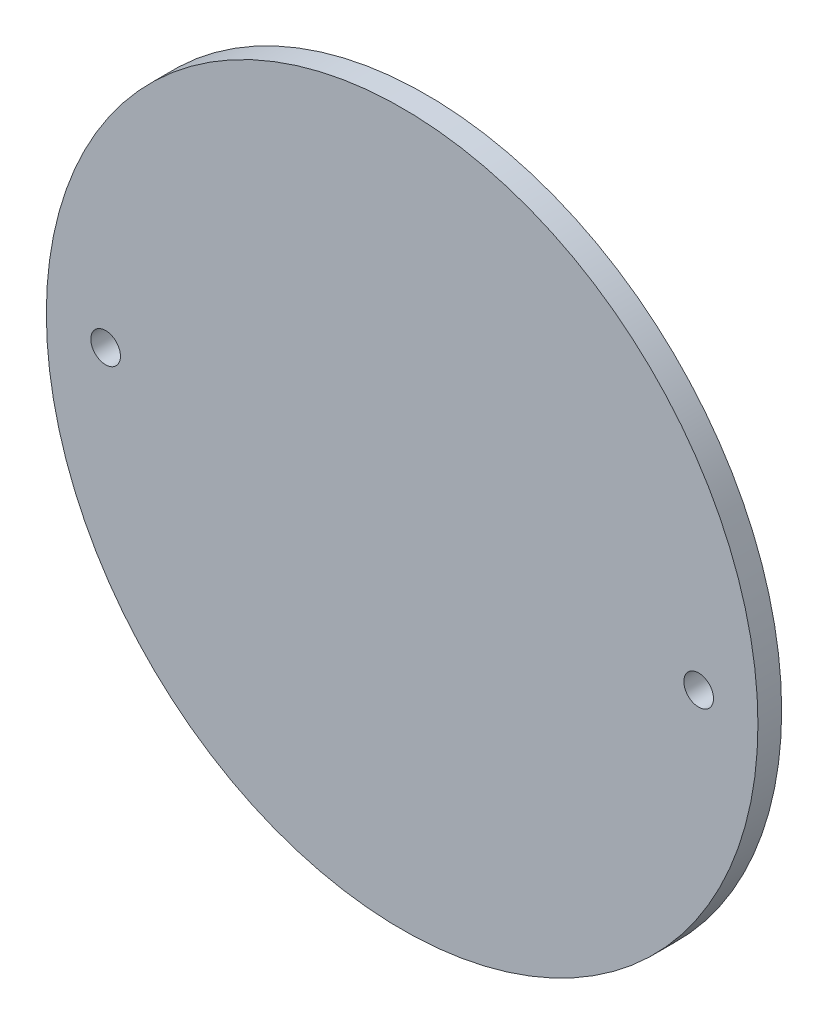
ISO-10303-21;
HEADER;
FILE_DESCRIPTION(('STEP AP214'),'2;1');
FILE_NAME('part.step','',(''),(''),'','','');
FILE_SCHEMA(('AUTOMOTIVE_DESIGN { 1 0 10303 214 1 1 1 1 }'));
ENDSEC;
DATA;
#1=APPLICATION_CONTEXT('core data for automotive mechanical design processes');
#2=APPLICATION_PROTOCOL_DEFINITION('international standard','automotive_design',2000,#1);
#3=PRODUCT_CONTEXT('',#1,'mechanical');
#4=PRODUCT('Part','Part','',(#3));
#5=PRODUCT_RELATED_PRODUCT_CATEGORY('part','',(#4));
#6=PRODUCT_DEFINITION_FORMATION('','',#4);
#7=PRODUCT_DEFINITION_CONTEXT('part definition',#1,'design');
#8=PRODUCT_DEFINITION('design','',#6,#7);
#9=PRODUCT_DEFINITION_SHAPE('','',#8);
#10=(LENGTH_UNIT() NAMED_UNIT(*) SI_UNIT(.MILLI.,.METRE.));
#11=(NAMED_UNIT(*) PLANE_ANGLE_UNIT() SI_UNIT($,.RADIAN.));
#12=(NAMED_UNIT(*) SI_UNIT($,.STERADIAN.) SOLID_ANGLE_UNIT());
#13=UNCERTAINTY_MEASURE_WITH_UNIT(LENGTH_MEASURE(1.E-05),#10,'distance_accuracy_value','');
#14=(GEOMETRIC_REPRESENTATION_CONTEXT(3) GLOBAL_UNCERTAINTY_ASSIGNED_CONTEXT((#13)) GLOBAL_UNIT_ASSIGNED_CONTEXT((#10,
#11,#12)) REPRESENTATION_CONTEXT('',''));
#15=CARTESIAN_POINT('',(0.,0.,0.));
#16=DIRECTION('',(0.,0.,1.));
#17=DIRECTION('',(1.,0.,0.));
#18=AXIS2_PLACEMENT_3D('',#15,#16,#17);
#19=CARTESIAN_POINT('',(0.,0.,2.));
#20=DIRECTION('',(0.,0.,1.));
#21=DIRECTION('',(1.,0.,0.));
#22=AXIS2_PLACEMENT_3D('',#19,#20,#21);
#23=PLANE('',#22);
#24=CARTESIAN_POINT('',(25.,0.,2.));
#25=DIRECTION('',(0.,0.,1.));
#26=DIRECTION('',(1.,0.,0.));
#27=AXIS2_PLACEMENT_3D('',#24,#25,#26);
#28=CIRCLE('',#27,1.25);
#29=CARTESIAN_POINT('',(26.25,0.,2.));
#30=VERTEX_POINT('',#29);
#31=EDGE_CURVE('E42',#30,#30,#28,.T.);
#32=ORIENTED_EDGE('',*,*,#31,.F.);
#33=EDGE_LOOP('',(#32));
#34=FACE_BOUND('',#33,.T.);
#35=CARTESIAN_POINT('',(0.,0.,2.));
#36=DIRECTION('',(0.,0.,1.));
#37=DIRECTION('',(1.,0.,0.));
#38=AXIS2_PLACEMENT_3D('',#35,#36,#37);
#39=CIRCLE('',#38,30.);
#40=CARTESIAN_POINT('',(30.,0.,2.));
#41=VERTEX_POINT('',#40);
#42=EDGE_CURVE('E10',#41,#41,#39,.T.);
#43=ORIENTED_EDGE('',*,*,#42,.T.);
#44=EDGE_LOOP('',(#43));
#45=FACE_BOUND('',#44,.T.);
#46=CARTESIAN_POINT('',(-25.,0.,2.));
#47=DIRECTION('',(0.,0.,1.));
#48=DIRECTION('',(1.,0.,0.));
#49=AXIS2_PLACEMENT_3D('',#46,#47,#48);
#50=CIRCLE('',#49,1.25);
#51=CARTESIAN_POINT('',(-23.75,0.,2.));
#52=VERTEX_POINT('',#51);
#53=EDGE_CURVE('E47',#52,#52,#50,.T.);
#54=ORIENTED_EDGE('',*,*,#53,.F.);
#55=EDGE_LOOP('',(#54));
#56=FACE_BOUND('',#55,.T.);
#57=ADVANCED_FACE('F31',(#34,#45,#56),#23,.T.);
#58=CARTESIAN_POINT('',(0.,0.,0.));
#59=DIRECTION('',(0.,0.,1.));
#60=DIRECTION('',(1.,0.,0.));
#61=AXIS2_PLACEMENT_3D('',#58,#59,#60);
#62=PLANE('',#61);
#63=CARTESIAN_POINT('',(25.,0.,0.));
#64=DIRECTION('',(0.,0.,1.));
#65=DIRECTION('',(1.,0.,0.));
#66=AXIS2_PLACEMENT_3D('',#63,#64,#65);
#67=CIRCLE('',#66,1.25);
#68=CARTESIAN_POINT('',(26.25,0.,0.));
#69=VERTEX_POINT('',#68);
#70=EDGE_CURVE('E44',#69,#69,#67,.T.);
#71=ORIENTED_EDGE('',*,*,#70,.T.);
#72=EDGE_LOOP('',(#71));
#73=FACE_BOUND('',#72,.T.);
#74=CARTESIAN_POINT('',(0.,0.,0.));
#75=DIRECTION('',(0.,0.,1.));
#76=DIRECTION('',(1.,0.,0.));
#77=AXIS2_PLACEMENT_3D('',#74,#75,#76);
#78=CIRCLE('',#77,30.);
#79=CARTESIAN_POINT('',(30.,0.,0.));
#80=VERTEX_POINT('',#79);
#81=EDGE_CURVE('E35',#80,#80,#78,.T.);
#82=ORIENTED_EDGE('',*,*,#81,.F.);
#83=EDGE_LOOP('',(#82));
#84=FACE_BOUND('',#83,.T.);
#85=CARTESIAN_POINT('',(-25.,0.,0.));
#86=DIRECTION('',(0.,0.,1.));
#87=DIRECTION('',(1.,0.,0.));
#88=AXIS2_PLACEMENT_3D('',#85,#86,#87);
#89=CIRCLE('',#88,1.25);
#90=CARTESIAN_POINT('',(-23.75,0.,0.));
#91=VERTEX_POINT('',#90);
#92=EDGE_CURVE('E50',#91,#91,#89,.T.);
#93=ORIENTED_EDGE('',*,*,#92,.T.);
#94=EDGE_LOOP('',(#93));
#95=FACE_BOUND('',#94,.T.);
#96=ADVANCED_FACE('F60',(#73,#84,#95),#62,.F.);
#97=CARTESIAN_POINT('',(0.,0.,2.));
#98=DIRECTION('',(0.,0.,-1.));
#99=DIRECTION('',(-1.,0.,0.));
#100=AXIS2_PLACEMENT_3D('',#97,#98,#99);
#101=CYLINDRICAL_SURFACE('',#100,30.);
#102=ORIENTED_EDGE('',*,*,#42,.F.);
#103=EDGE_LOOP('',(#102));
#104=FACE_BOUND('',#103,.T.);
#105=ORIENTED_EDGE('',*,*,#81,.T.);
#106=EDGE_LOOP('',(#105));
#107=FACE_BOUND('',#106,.T.);
#108=ADVANCED_FACE('F33',(#104,#107),#101,.T.);
#109=CARTESIAN_POINT('',(25.,0.,2.));
#110=DIRECTION('',(0.,0.,-1.));
#111=DIRECTION('',(-1.,0.,0.));
#112=AXIS2_PLACEMENT_3D('',#109,#110,#111);
#113=CYLINDRICAL_SURFACE('',#112,1.25);
#114=ORIENTED_EDGE('',*,*,#31,.T.);
#115=EDGE_LOOP('',(#114));
#116=FACE_BOUND('',#115,.T.);
#117=ORIENTED_EDGE('',*,*,#70,.F.);
#118=EDGE_LOOP('',(#117));
#119=FACE_BOUND('',#118,.T.);
#120=ADVANCED_FACE('F69',(#116,#119),#113,.F.);
#121=CARTESIAN_POINT('',(-25.,0.,2.));
#122=DIRECTION('',(0.,0.,-1.));
#123=DIRECTION('',(-1.,0.,0.));
#124=AXIS2_PLACEMENT_3D('',#121,#122,#123);
#125=CYLINDRICAL_SURFACE('',#124,1.25);
#126=ORIENTED_EDGE('',*,*,#53,.T.);
#127=EDGE_LOOP('',(#126));
#128=FACE_BOUND('',#127,.T.);
#129=ORIENTED_EDGE('',*,*,#92,.F.);
#130=EDGE_LOOP('',(#129));
#131=FACE_BOUND('',#130,.T.);
#132=ADVANCED_FACE('F56',(#128,#131),#125,.F.);
#133=CLOSED_SHELL('',(#57,#96,#108,#120,#132));
#134=MANIFOLD_SOLID_BREP('B2',#133);
#135=ADVANCED_BREP_SHAPE_REPRESENTATION('',(#18,#134),#14);
#136=SHAPE_DEFINITION_REPRESENTATION(#9,#135);
ENDSEC;
END-ISO-10303-21;
